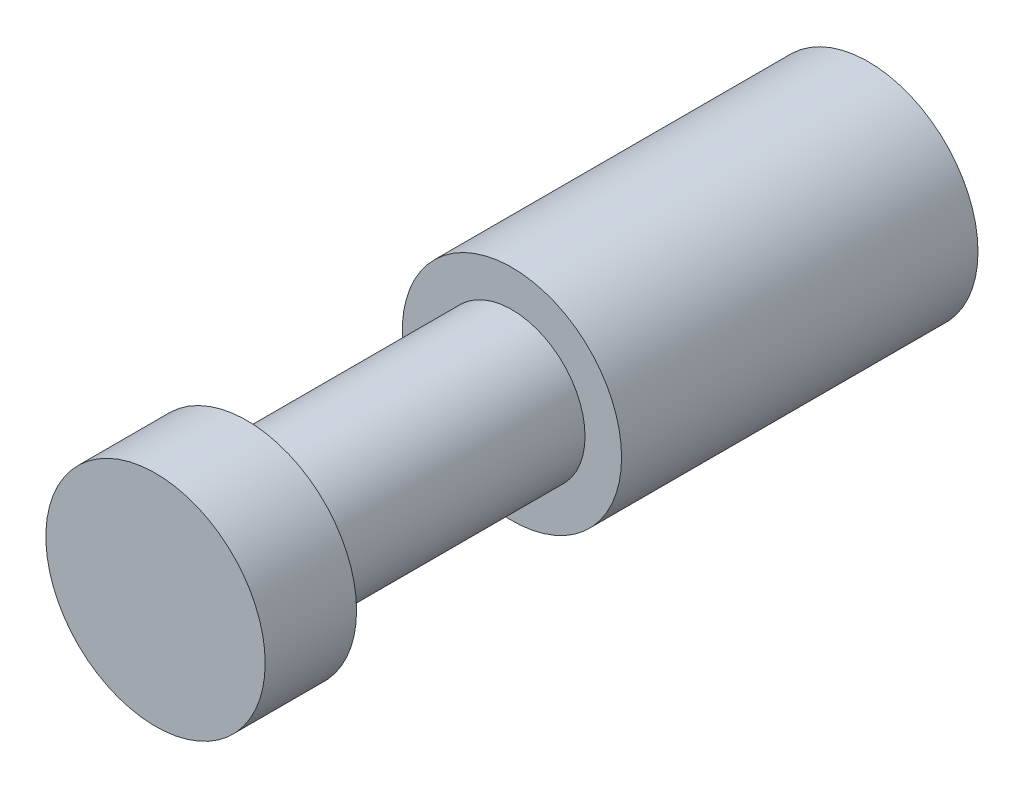
ISO-10303-21;
HEADER;
FILE_DESCRIPTION(('STEP AP214'),'2;1');
FILE_NAME('part.step','',(''),(''),'','','');
FILE_SCHEMA(('AUTOMOTIVE_DESIGN { 1 0 10303 214 1 1 1 1 }'));
ENDSEC;
DATA;
#1=APPLICATION_CONTEXT('core data for automotive mechanical design processes');
#2=APPLICATION_PROTOCOL_DEFINITION('international standard','automotive_design',2000,#1);
#3=PRODUCT_CONTEXT('',#1,'mechanical');
#4=PRODUCT('Part','Part','',(#3));
#5=PRODUCT_RELATED_PRODUCT_CATEGORY('part','',(#4));
#6=PRODUCT_DEFINITION_FORMATION('','',#4);
#7=PRODUCT_DEFINITION_CONTEXT('part definition',#1,'design');
#8=PRODUCT_DEFINITION('design','',#6,#7);
#9=PRODUCT_DEFINITION_SHAPE('','',#8);
#10=(LENGTH_UNIT() NAMED_UNIT(*) SI_UNIT(.MILLI.,.METRE.));
#11=(NAMED_UNIT(*) PLANE_ANGLE_UNIT() SI_UNIT($,.RADIAN.));
#12=(NAMED_UNIT(*) SI_UNIT($,.STERADIAN.) SOLID_ANGLE_UNIT());
#13=UNCERTAINTY_MEASURE_WITH_UNIT(LENGTH_MEASURE(1.E-05),#10,'distance_accuracy_value','');
#14=(GEOMETRIC_REPRESENTATION_CONTEXT(3) GLOBAL_UNCERTAINTY_ASSIGNED_CONTEXT((#13)) GLOBAL_UNIT_ASSIGNED_CONTEXT((#10,
#11,#12)) REPRESENTATION_CONTEXT('',''));
#15=CARTESIAN_POINT('',(0.,0.,0.));
#16=DIRECTION('',(0.,0.,1.));
#17=DIRECTION('',(1.,0.,0.));
#18=AXIS2_PLACEMENT_3D('',#15,#16,#17);
#19=CARTESIAN_POINT('',(0.,0.,0.));
#20=DIRECTION('',(0.,0.,1.));
#21=DIRECTION('',(1.,0.,0.));
#22=AXIS2_PLACEMENT_3D('',#19,#20,#21);
#23=PLANE('',#22);
#24=CARTESIAN_POINT('',(0.,0.,0.));
#25=DIRECTION('',(0.,0.,1.));
#26=DIRECTION('',(1.,0.,0.));
#27=AXIS2_PLACEMENT_3D('',#24,#25,#26);
#28=CIRCLE('',#27,6.);
#29=CARTESIAN_POINT('',(6.,0.,0.));
#30=VERTEX_POINT('',#29);
#31=EDGE_CURVE('E10',#30,#30,#28,.T.);
#32=ORIENTED_EDGE('',*,*,#31,.F.);
#33=EDGE_LOOP('',(#32));
#34=FACE_BOUND('',#33,.T.);
#35=CARTESIAN_POINT('',(0.,0.,0.));
#36=DIRECTION('',(0.,0.,1.));
#37=DIRECTION('',(1.,0.,0.));
#38=AXIS2_PLACEMENT_3D('',#35,#36,#37);
#39=CIRCLE('',#38,4.4);
#40=CARTESIAN_POINT('',(4.4,0.,0.));
#41=VERTEX_POINT('',#40);
#42=EDGE_CURVE('E39',#41,#41,#39,.T.);
#43=ORIENTED_EDGE('',*,*,#42,.T.);
#44=EDGE_LOOP('',(#43));
#45=FACE_BOUND('',#44,.T.);
#46=ADVANCED_FACE('F31',(#34,#45),#23,.F.);
#47=CARTESIAN_POINT('',(0.,0.,12.));
#48=DIRECTION('',(0.,0.,-1.));
#49=DIRECTION('',(-1.,0.,0.));
#50=AXIS2_PLACEMENT_3D('',#47,#48,#49);
#51=CYLINDRICAL_SURFACE('',#50,6.);
#52=ORIENTED_EDGE('',*,*,#31,.T.);
#53=EDGE_LOOP('',(#52));
#54=FACE_BOUND('',#53,.T.);
#55=CARTESIAN_POINT('',(0.,0.,19.5));
#56=DIRECTION('',(0.,0.,1.));
#57=DIRECTION('',(1.,0.,0.));
#58=AXIS2_PLACEMENT_3D('',#55,#56,#57);
#59=CIRCLE('',#58,6.);
#60=CARTESIAN_POINT('',(6.,0.,19.5));
#61=VERTEX_POINT('',#60);
#62=EDGE_CURVE('E57',#61,#61,#59,.T.);
#63=ORIENTED_EDGE('',*,*,#62,.F.);
#64=EDGE_LOOP('',(#63));
#65=FACE_BOUND('',#64,.T.);
#66=ADVANCED_FACE('F33',(#54,#65),#51,.T.);
#67=CARTESIAN_POINT('',(0.,0.,12.));
#68=DIRECTION('',(0.,0.,-1.));
#69=DIRECTION('',(-1.,0.,0.));
#70=AXIS2_PLACEMENT_3D('',#67,#68,#69);
#71=CYLINDRICAL_SURFACE('',#70,4.4);
#72=CARTESIAN_POINT('',(0.,0.,12.));
#73=DIRECTION('',(0.,0.,1.));
#74=DIRECTION('',(1.,0.,0.));
#75=AXIS2_PLACEMENT_3D('',#72,#73,#74);
#76=CIRCLE('',#75,4.4);
#77=CARTESIAN_POINT('',(4.4,0.,12.));
#78=VERTEX_POINT('',#77);
#79=EDGE_CURVE('E43',#78,#78,#76,.T.);
#80=ORIENTED_EDGE('',*,*,#79,.T.);
#81=EDGE_LOOP('',(#80));
#82=FACE_BOUND('',#81,.T.);
#83=ORIENTED_EDGE('',*,*,#42,.F.);
#84=EDGE_LOOP('',(#83));
#85=FACE_BOUND('',#84,.T.);
#86=ADVANCED_FACE('F79',(#82,#85),#71,.F.);
#87=CARTESIAN_POINT('',(0.,0.,12.));
#88=DIRECTION('',(0.,0.,1.));
#89=DIRECTION('',(1.,0.,0.));
#90=AXIS2_PLACEMENT_3D('',#87,#88,#89);
#91=PLANE('',#90);
#92=ORIENTED_EDGE('',*,*,#79,.F.);
#93=EDGE_LOOP('',(#92));
#94=FACE_BOUND('',#93,.T.);
#95=ADVANCED_FACE('F70',(#94),#91,.F.);
#96=CARTESIAN_POINT('',(0.,0.,19.5));
#97=DIRECTION('',(0.,0.,1.));
#98=DIRECTION('',(1.,0.,0.));
#99=AXIS2_PLACEMENT_3D('',#96,#97,#98);
#100=PLANE('',#99);
#101=CARTESIAN_POINT('',(0.,0.,19.5));
#102=DIRECTION('',(0.,0.,1.));
#103=DIRECTION('',(1.,0.,0.));
#104=AXIS2_PLACEMENT_3D('',#101,#102,#103);
#105=CIRCLE('',#104,4.);
#106=CARTESIAN_POINT('',(4.,0.,19.5));
#107=VERTEX_POINT('',#106);
#108=EDGE_CURVE('E35',#107,#107,#105,.T.);
#109=ORIENTED_EDGE('',*,*,#108,.F.);
#110=EDGE_LOOP('',(#109));
#111=FACE_BOUND('',#110,.T.);
#112=ORIENTED_EDGE('',*,*,#62,.T.);
#113=EDGE_LOOP('',(#112));
#114=FACE_BOUND('',#113,.T.);
#115=ADVANCED_FACE('F67',(#111,#114),#100,.T.);
#116=CARTESIAN_POINT('',(0.,0.,39.));
#117=DIRECTION('',(0.,0.,1.));
#118=DIRECTION('',(1.,0.,0.));
#119=AXIS2_PLACEMENT_3D('',#116,#117,#118);
#120=PLANE('',#119);
#121=CARTESIAN_POINT('',(0.,0.,39.));
#122=DIRECTION('',(0.,0.,1.));
#123=DIRECTION('',(1.,0.,0.));
#124=AXIS2_PLACEMENT_3D('',#121,#122,#123);
#125=CIRCLE('',#124,6.);
#126=CARTESIAN_POINT('',(6.,0.,39.));
#127=VERTEX_POINT('',#126);
#128=EDGE_CURVE('E51',#127,#127,#125,.T.);
#129=ORIENTED_EDGE('',*,*,#128,.T.);
#130=EDGE_LOOP('',(#129));
#131=FACE_BOUND('',#130,.T.);
#132=ADVANCED_FACE('F69',(#131),#120,.T.);
#133=CARTESIAN_POINT('',(0.,0.,39.));
#134=DIRECTION('',(0.,0.,-1.));
#135=DIRECTION('',(-1.,0.,0.));
#136=AXIS2_PLACEMENT_3D('',#133,#134,#135);
#137=CYLINDRICAL_SURFACE('',#136,6.);
#138=ORIENTED_EDGE('',*,*,#128,.F.);
#139=EDGE_LOOP('',(#138));
#140=FACE_BOUND('',#139,.T.);
#141=CARTESIAN_POINT('',(0.,0.,34.));
#142=DIRECTION('',(0.,0.,1.));
#143=DIRECTION('',(1.,0.,0.));
#144=AXIS2_PLACEMENT_3D('',#141,#142,#143);
#145=CIRCLE('',#144,6.);
#146=CARTESIAN_POINT('',(6.,0.,34.));
#147=VERTEX_POINT('',#146);
#148=EDGE_CURVE('E52',#147,#147,#145,.T.);
#149=ORIENTED_EDGE('',*,*,#148,.T.);
#150=EDGE_LOOP('',(#149));
#151=FACE_BOUND('',#150,.T.);
#152=ADVANCED_FACE('F76',(#140,#151),#137,.T.);
#153=CARTESIAN_POINT('',(0.,0.,34.));
#154=DIRECTION('',(0.,0.,1.));
#155=DIRECTION('',(1.,0.,0.));
#156=AXIS2_PLACEMENT_3D('',#153,#154,#155);
#157=PLANE('',#156);
#158=CARTESIAN_POINT('',(0.,0.,34.));
#159=DIRECTION('',(0.,0.,1.));
#160=DIRECTION('',(1.,0.,0.));
#161=AXIS2_PLACEMENT_3D('',#158,#159,#160);
#162=CIRCLE('',#161,4.);
#163=CARTESIAN_POINT('',(4.,0.,34.));
#164=VERTEX_POINT('',#163);
#165=EDGE_CURVE('E48',#164,#164,#162,.T.);
#166=ORIENTED_EDGE('',*,*,#165,.T.);
#167=EDGE_LOOP('',(#166));
#168=FACE_BOUND('',#167,.T.);
#169=ORIENTED_EDGE('',*,*,#148,.F.);
#170=EDGE_LOOP('',(#169));
#171=FACE_BOUND('',#170,.T.);
#172=ADVANCED_FACE('F94',(#168,#171),#157,.F.);
#173=CARTESIAN_POINT('',(0.,0.,34.));
#174=DIRECTION('',(0.,0.,-1.));
#175=DIRECTION('',(-1.,0.,0.));
#176=AXIS2_PLACEMENT_3D('',#173,#174,#175);
#177=CYLINDRICAL_SURFACE('',#176,4.);
#178=ORIENTED_EDGE('',*,*,#108,.T.);
#179=EDGE_LOOP('',(#178));
#180=FACE_BOUND('',#179,.T.);
#181=ORIENTED_EDGE('',*,*,#165,.F.);
#182=EDGE_LOOP('',(#181));
#183=FACE_BOUND('',#182,.T.);
#184=ADVANCED_FACE('F64',(#180,#183),#177,.T.);
#185=CLOSED_SHELL('',(#46,#66,#86,#95,#115,#132,#152,#172,#184));
#186=MANIFOLD_SOLID_BREP('B2',#185);
#187=ADVANCED_BREP_SHAPE_REPRESENTATION('',(#18,#186),#14);
#188=SHAPE_DEFINITION_REPRESENTATION(#9,#187);
ENDSEC;
END-ISO-10303-21;
